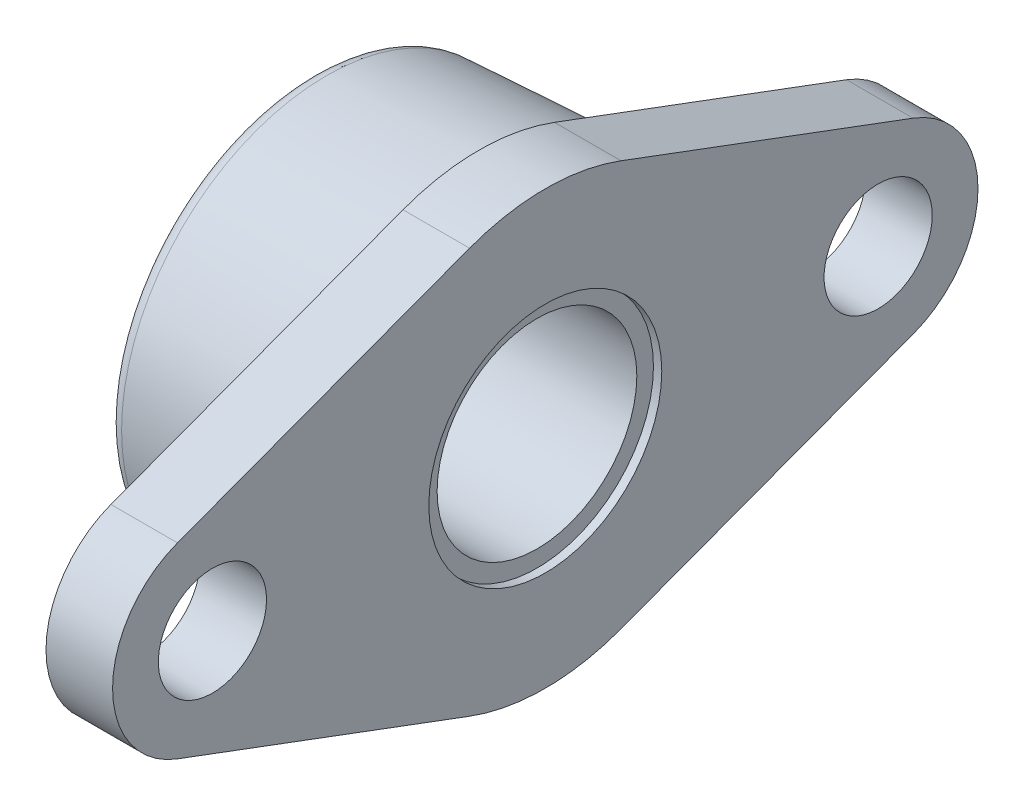
ISO-10303-21;
HEADER;
FILE_DESCRIPTION(('STEP AP214'),'2;1');
FILE_NAME('part.step','',(''),(''),'','','');
FILE_SCHEMA(('AUTOMOTIVE_DESIGN { 1 0 10303 214 1 1 1 1 }'));
ENDSEC;
DATA;
#1=APPLICATION_CONTEXT('core data for automotive mechanical design processes');
#2=APPLICATION_PROTOCOL_DEFINITION('international standard','automotive_design',2000,#1);
#3=PRODUCT_CONTEXT('',#1,'mechanical');
#4=PRODUCT('Part','Part','',(#3));
#5=PRODUCT_RELATED_PRODUCT_CATEGORY('part','',(#4));
#6=PRODUCT_DEFINITION_FORMATION('','',#4);
#7=PRODUCT_DEFINITION_CONTEXT('part definition',#1,'design');
#8=PRODUCT_DEFINITION('design','',#6,#7);
#9=PRODUCT_DEFINITION_SHAPE('','',#8);
#10=(LENGTH_UNIT() NAMED_UNIT(*) SI_UNIT(.MILLI.,.METRE.));
#11=(NAMED_UNIT(*) PLANE_ANGLE_UNIT() SI_UNIT($,.RADIAN.));
#12=(NAMED_UNIT(*) SI_UNIT($,.STERADIAN.) SOLID_ANGLE_UNIT());
#13=UNCERTAINTY_MEASURE_WITH_UNIT(LENGTH_MEASURE(1.E-05),#10,'distance_accuracy_value','');
#14=(GEOMETRIC_REPRESENTATION_CONTEXT(3) GLOBAL_UNCERTAINTY_ASSIGNED_CONTEXT((#13)) GLOBAL_UNIT_ASSIGNED_CONTEXT((#10,
#11,#12)) REPRESENTATION_CONTEXT('',''));
#15=CARTESIAN_POINT('',(0.,0.,0.));
#16=DIRECTION('',(0.,0.,1.));
#17=DIRECTION('',(1.,0.,0.));
#18=AXIS2_PLACEMENT_3D('',#15,#16,#17);
#19=CARTESIAN_POINT('',(0.,0.,0.));
#20=DIRECTION('',(-1.,0.,0.));
#21=DIRECTION('',(0.,0.,1.));
#22=AXIS2_PLACEMENT_3D('',#19,#20,#21);
#23=CYLINDRICAL_SURFACE('',#22,9.525);
#24=CARTESIAN_POINT('',(-22.2250000000001,0.,0.));
#25=DIRECTION('',(-1.,0.,0.));
#26=DIRECTION('',(0.,0.,1.));
#27=AXIS2_PLACEMENT_3D('',#24,#25,#26);
#28=CIRCLE('',#27,9.525);
#29=CARTESIAN_POINT('',(-22.2250000000001,0.,9.52499999999999));
#30=VERTEX_POINT('',#29);
#31=EDGE_CURVE('E170',#30,#30,#28,.T.);
#32=ORIENTED_EDGE('',*,*,#31,.T.);
#33=EDGE_LOOP('',(#32));
#34=FACE_BOUND('',#33,.T.);
#35=CARTESIAN_POINT('',(-0.793750000000037,0.,0.));
#36=DIRECTION('',(1.,0.,0.));
#37=DIRECTION('',(0.,0.,-1.));
#38=AXIS2_PLACEMENT_3D('',#35,#36,#37);
#39=CIRCLE('',#38,9.525);
#40=CARTESIAN_POINT('',(-0.793750000000037,0.,-9.525));
#41=VERTEX_POINT('',#40);
#42=EDGE_CURVE('E168',#41,#41,#39,.F.);
#43=ORIENTED_EDGE('',*,*,#42,.F.);
#44=EDGE_LOOP('',(#43));
#45=FACE_BOUND('',#44,.T.);
#46=ADVANCED_FACE('F34',(#34,#45),#23,.F.);
#47=CARTESIAN_POINT('',(-22.2250000000001,0.,0.));
#48=DIRECTION('',(-1.,0.,0.));
#49=DIRECTION('',(0.,0.,1.));
#50=AXIS2_PLACEMENT_3D('',#47,#48,#49);
#51=PLANE('',#50);
#52=CARTESIAN_POINT('',(-22.2250000000001,0.,0.));
#53=DIRECTION('',(-1.,0.,0.));
#54=DIRECTION('',(0.,0.,1.));
#55=AXIS2_PLACEMENT_3D('',#52,#53,#54);
#56=CIRCLE('',#55,18.1169039807405);
#57=CARTESIAN_POINT('',(-22.2250000000001,0.,18.1169039807405));
#58=VERTEX_POINT('',#57);
#59=EDGE_CURVE('E43',#58,#58,#56,.T.);
#60=ORIENTED_EDGE('',*,*,#59,.T.);
#61=EDGE_LOOP('',(#60));
#62=FACE_BOUND('',#61,.T.);
#63=CARTESIAN_POINT('',(-22.2250000000001,0.,0.));
#64=DIRECTION('',(-1.,0.,0.));
#65=DIRECTION('',(0.,0.,1.));
#66=AXIS2_PLACEMENT_3D('',#63,#64,#65);
#67=CIRCLE('',#66,11.1125);
#68=CARTESIAN_POINT('',(-22.2250000000001,0.,11.1125));
#69=VERTEX_POINT('',#68);
#70=EDGE_CURVE('E269',#69,#69,#67,.T.);
#71=ORIENTED_EDGE('',*,*,#70,.F.);
#72=EDGE_LOOP('',(#71));
#73=FACE_BOUND('',#72,.T.);
#74=ADVANCED_FACE('F223',(#62,#73),#51,.T.);
#75=CARTESIAN_POINT('',(-6.34999999999997,0.,0.));
#76=DIRECTION('',(1.,0.,0.));
#77=DIRECTION('',(0.,0.,-1.));
#78=AXIS2_PLACEMENT_3D('',#75,#76,#77);
#79=CYLINDRICAL_SURFACE('',#78,20.6375);
#80=CARTESIAN_POINT('',(0.,0.,0.));
#81=DIRECTION('',(1.,0.,0.));
#82=DIRECTION('',(0.,0.,-1.));
#83=AXIS2_PLACEMENT_3D('',#80,#81,#82);
#84=CIRCLE('',#83,20.6375);
#85=CARTESIAN_POINT('',(0.,-19.332171928792,7.223125));
#86=VERTEX_POINT('',#85);
#87=CARTESIAN_POINT('',(0.,-19.332171928792,-7.223125));
#88=VERTEX_POINT('',#87);
#89=EDGE_CURVE('E134',#86,#88,#84,.T.);
#90=ORIENTED_EDGE('',*,*,#89,.F.);
#91=DIRECTION('',(1.,0.,0.));
#92=VECTOR('',#91,1.);
#93=CARTESIAN_POINT('',(-6.34999999999997,-19.332171928792,7.223125));
#94=LINE('',#93,#92);
#95=CARTESIAN_POINT('',(-6.34999999999997,-19.332171928792,7.223125));
#96=VERTEX_POINT('',#95);
#97=EDGE_CURVE('E51',#96,#86,#94,.T.);
#98=ORIENTED_EDGE('',*,*,#97,.F.);
#99=CARTESIAN_POINT('',(-6.34999999999997,0.,0.));
#100=DIRECTION('',(1.,0.,0.));
#101=DIRECTION('',(0.,0.,-1.));
#102=AXIS2_PLACEMENT_3D('',#99,#100,#101);
#103=CIRCLE('',#102,20.6375);
#104=CARTESIAN_POINT('',(-6.34999999999997,-19.332171928792,-7.223125));
#105=VERTEX_POINT('',#104);
#106=EDGE_CURVE('E156',#96,#105,#103,.T.);
#107=ORIENTED_EDGE('',*,*,#106,.T.);
#108=DIRECTION('',(1.,0.,0.));
#109=VECTOR('',#108,1.);
#110=CARTESIAN_POINT('',(-6.34999999999997,-19.332171928792,-7.223125));
#111=LINE('',#110,#109);
#112=EDGE_CURVE('E92',#105,#88,#111,.T.);
#113=ORIENTED_EDGE('',*,*,#112,.T.);
#114=EDGE_LOOP('',(#90,#98,#107,#113));
#115=FACE_BOUND('',#114,.T.);
#116=ADVANCED_FACE('F211',(#115),#79,.T.);
#117=CARTESIAN_POINT('',(-6.34999999999997,-19.332171928792,7.223125));
#118=DIRECTION('',(0.,-0.93674969975976,0.35));
#119=DIRECTION('',(0.,-0.35,-0.93674969975976));
#120=AXIS2_PLACEMENT_3D('',#117,#118,#119);
#121=PLANE('',#120);
#122=DIRECTION('',(0.,-0.35,-0.93674969975976));
#123=VECTOR('',#122,1.);
#124=CARTESIAN_POINT('',(0.,-19.332171928792,7.223125));
#125=LINE('',#124,#123);
#126=CARTESIAN_POINT('',(0.,-8.92254089021174,35.08375));
#127=VERTEX_POINT('',#126);
#128=EDGE_CURVE('E153',#127,#86,#125,.T.);
#129=ORIENTED_EDGE('',*,*,#128,.F.);
#130=DIRECTION('',(1.,0.,0.));
#131=VECTOR('',#130,1.);
#132=CARTESIAN_POINT('',(-6.34999999999997,-8.92254089021174,35.08375));
#133=LINE('',#132,#131);
#134=CARTESIAN_POINT('',(-6.34999999999997,-8.92254089021174,35.08375));
#135=VERTEX_POINT('',#134);
#136=EDGE_CURVE('E80',#135,#127,#133,.T.);
#137=ORIENTED_EDGE('',*,*,#136,.F.);
#138=DIRECTION('',(0.,-0.35,-0.93674969975976));
#139=VECTOR('',#138,1.);
#140=CARTESIAN_POINT('',(-6.34999999999997,-19.332171928792,7.223125));
#141=LINE('',#140,#139);
#142=EDGE_CURVE('E124',#135,#96,#141,.T.);
#143=ORIENTED_EDGE('',*,*,#142,.T.);
#144=ORIENTED_EDGE('',*,*,#97,.T.);
#145=EDGE_LOOP('',(#129,#137,#143,#144));
#146=FACE_BOUND('',#145,.T.);
#147=ADVANCED_FACE('F215',(#146),#121,.T.);
#148=CARTESIAN_POINT('',(-6.34999999999997,0.,31.7500000000001));
#149=DIRECTION('',(1.,0.,0.));
#150=DIRECTION('',(0.,0.,-1.));
#151=AXIS2_PLACEMENT_3D('',#148,#149,#150);
#152=CYLINDRICAL_SURFACE('',#151,9.525);
#153=CARTESIAN_POINT('',(0.,0.,31.7500000000001));
#154=DIRECTION('',(1.,0.,0.));
#155=DIRECTION('',(0.,0.,-1.));
#156=AXIS2_PLACEMENT_3D('',#153,#154,#155);
#157=CIRCLE('',#156,9.525);
#158=CARTESIAN_POINT('',(0.,8.92254089021166,35.0837500000001));
#159=VERTEX_POINT('',#158);
#160=EDGE_CURVE('E111',#159,#127,#157,.T.);
#161=ORIENTED_EDGE('',*,*,#160,.F.);
#162=DIRECTION('',(1.,0.,0.));
#163=VECTOR('',#162,1.);
#164=CARTESIAN_POINT('',(-6.34999999999997,8.92254089021166,35.0837500000001));
#165=LINE('',#164,#163);
#166=CARTESIAN_POINT('',(-6.34999999999997,8.92254089021166,35.0837500000001));
#167=VERTEX_POINT('',#166);
#168=EDGE_CURVE('E106',#167,#159,#165,.T.);
#169=ORIENTED_EDGE('',*,*,#168,.F.);
#170=CARTESIAN_POINT('',(-6.34999999999997,0.,31.7500000000001));
#171=DIRECTION('',(1.,0.,0.));
#172=DIRECTION('',(0.,0.,-1.));
#173=AXIS2_PLACEMENT_3D('',#170,#171,#172);
#174=CIRCLE('',#173,9.525);
#175=EDGE_CURVE('E109',#167,#135,#174,.T.);
#176=ORIENTED_EDGE('',*,*,#175,.T.);
#177=ORIENTED_EDGE('',*,*,#136,.T.);
#178=EDGE_LOOP('',(#161,#169,#176,#177));
#179=FACE_BOUND('',#178,.T.);
#180=ADVANCED_FACE('F108',(#179),#152,.T.);
#181=CARTESIAN_POINT('',(-6.34999999999997,19.3321719287921,7.223125));
#182=DIRECTION('',(0.,0.93674969975976,0.35));
#183=DIRECTION('',(0.,-0.35,0.93674969975976));
#184=AXIS2_PLACEMENT_3D('',#181,#182,#183);
#185=PLANE('',#184);
#186=DIRECTION('',(0.,-0.35,0.93674969975976));
#187=VECTOR('',#186,1.);
#188=CARTESIAN_POINT('',(0.,19.3321719287921,7.223125));
#189=LINE('',#188,#187);
#190=CARTESIAN_POINT('',(0.,19.3321719287921,7.223125));
#191=VERTEX_POINT('',#190);
#192=EDGE_CURVE('E150',#191,#159,#189,.T.);
#193=ORIENTED_EDGE('',*,*,#192,.F.);
#194=DIRECTION('',(1.,0.,0.));
#195=VECTOR('',#194,1.);
#196=CARTESIAN_POINT('',(-6.34999999999997,19.3321719287921,7.223125));
#197=LINE('',#196,#195);
#198=CARTESIAN_POINT('',(-6.34999999999997,19.3321719287921,7.223125));
#199=VERTEX_POINT('',#198);
#200=EDGE_CURVE('E116',#199,#191,#197,.T.);
#201=ORIENTED_EDGE('',*,*,#200,.F.);
#202=DIRECTION('',(0.,-0.35,0.93674969975976));
#203=VECTOR('',#202,1.);
#204=CARTESIAN_POINT('',(-6.34999999999997,19.3321719287921,7.223125));
#205=LINE('',#204,#203);
#206=EDGE_CURVE('E122',#199,#167,#205,.T.);
#207=ORIENTED_EDGE('',*,*,#206,.T.);
#208=ORIENTED_EDGE('',*,*,#168,.T.);
#209=EDGE_LOOP('',(#193,#201,#207,#208));
#210=FACE_BOUND('',#209,.T.);
#211=ADVANCED_FACE('F126',(#210),#185,.T.);
#212=CARTESIAN_POINT('',(-6.34999999999997,0.,0.));
#213=DIRECTION('',(1.,0.,0.));
#214=DIRECTION('',(0.,0.,-1.));
#215=AXIS2_PLACEMENT_3D('',#212,#213,#214);
#216=CYLINDRICAL_SURFACE('',#215,20.6375);
#217=CARTESIAN_POINT('',(0.,0.,0.));
#218=DIRECTION('',(1.,0.,0.));
#219=DIRECTION('',(0.,0.,-1.));
#220=AXIS2_PLACEMENT_3D('',#217,#218,#219);
#221=CIRCLE('',#220,20.6375);
#222=CARTESIAN_POINT('',(0.,19.3321719287921,-7.22312500000011));
#223=VERTEX_POINT('',#222);
#224=EDGE_CURVE('E147',#223,#191,#221,.T.);
#225=ORIENTED_EDGE('',*,*,#224,.F.);
#226=DIRECTION('',(1.,0.,0.));
#227=VECTOR('',#226,1.);
#228=CARTESIAN_POINT('',(-6.34999999999997,19.3321719287921,-7.22312500000011));
#229=LINE('',#228,#227);
#230=CARTESIAN_POINT('',(-6.34999999999997,19.3321719287921,-7.22312500000011));
#231=VERTEX_POINT('',#230);
#232=EDGE_CURVE('E161',#231,#223,#229,.T.);
#233=ORIENTED_EDGE('',*,*,#232,.F.);
#234=CARTESIAN_POINT('',(-6.34999999999997,0.,0.));
#235=DIRECTION('',(1.,0.,0.));
#236=DIRECTION('',(0.,0.,-1.));
#237=AXIS2_PLACEMENT_3D('',#234,#235,#236);
#238=CIRCLE('',#237,20.6375);
#239=EDGE_CURVE('E127',#231,#199,#238,.T.);
#240=ORIENTED_EDGE('',*,*,#239,.T.);
#241=ORIENTED_EDGE('',*,*,#200,.T.);
#242=EDGE_LOOP('',(#225,#233,#240,#241));
#243=FACE_BOUND('',#242,.T.);
#244=ADVANCED_FACE('F370',(#243),#216,.T.);
#245=CARTESIAN_POINT('',(-6.34999999999997,8.92254089021167,-35.0837500000002));
#246=DIRECTION('',(0.,0.93674969975976,-0.35));
#247=DIRECTION('',(0.,0.35,0.93674969975976));
#248=AXIS2_PLACEMENT_3D('',#245,#246,#247);
#249=PLANE('',#248);
#250=DIRECTION('',(0.,0.35,0.93674969975976));
#251=VECTOR('',#250,1.);
#252=CARTESIAN_POINT('',(0.,8.92254089021167,-35.0837500000002));
#253=LINE('',#252,#251);
#254=CARTESIAN_POINT('',(0.,8.92254089021167,-35.0837500000002));
#255=VERTEX_POINT('',#254);
#256=EDGE_CURVE('E144',#255,#223,#253,.T.);
#257=ORIENTED_EDGE('',*,*,#256,.F.);
#258=DIRECTION('',(1.,0.,0.));
#259=VECTOR('',#258,1.);
#260=CARTESIAN_POINT('',(-6.34999999999997,8.92254089021167,-35.0837500000002));
#261=LINE('',#260,#259);
#262=CARTESIAN_POINT('',(-6.34999999999997,8.92254089021167,-35.0837500000002));
#263=VERTEX_POINT('',#262);
#264=EDGE_CURVE('E163',#263,#255,#261,.T.);
#265=ORIENTED_EDGE('',*,*,#264,.F.);
#266=DIRECTION('',(0.,0.35,0.93674969975976));
#267=VECTOR('',#266,1.);
#268=CARTESIAN_POINT('',(-6.34999999999997,8.92254089021167,-35.0837500000002));
#269=LINE('',#268,#267);
#270=EDGE_CURVE('E129',#263,#231,#269,.T.);
#271=ORIENTED_EDGE('',*,*,#270,.T.);
#272=ORIENTED_EDGE('',*,*,#232,.T.);
#273=EDGE_LOOP('',(#257,#265,#271,#272));
#274=FACE_BOUND('',#273,.T.);
#275=ADVANCED_FACE('F204',(#274),#249,.T.);
#276=CARTESIAN_POINT('',(-6.34999999999997,0.,-31.7500000000001));
#277=DIRECTION('',(1.,0.,0.));
#278=DIRECTION('',(0.,0.,-1.));
#279=AXIS2_PLACEMENT_3D('',#276,#277,#278);
#280=CYLINDRICAL_SURFACE('',#279,9.525);
#281=CARTESIAN_POINT('',(0.,0.,-31.7500000000001));
#282=DIRECTION('',(1.,0.,0.));
#283=DIRECTION('',(0.,0.,-1.));
#284=AXIS2_PLACEMENT_3D('',#281,#282,#283);
#285=CIRCLE('',#284,9.525);
#286=CARTESIAN_POINT('',(0.,-8.92254089021175,-35.0837499999997));
#287=VERTEX_POINT('',#286);
#288=EDGE_CURVE('E141',#287,#255,#285,.T.);
#289=ORIENTED_EDGE('',*,*,#288,.F.);
#290=DIRECTION('',(1.,0.,0.));
#291=VECTOR('',#290,1.);
#292=CARTESIAN_POINT('',(-6.34999999999997,-8.92254089021175,-35.0837499999997));
#293=LINE('',#292,#291);
#294=CARTESIAN_POINT('',(-6.34999999999997,-8.92254089021175,-35.0837499999997));
#295=VERTEX_POINT('',#294);
#296=EDGE_CURVE('E165',#295,#287,#293,.T.);
#297=ORIENTED_EDGE('',*,*,#296,.F.);
#298=CARTESIAN_POINT('',(-6.34999999999997,0.,-31.7500000000001));
#299=DIRECTION('',(1.,0.,0.));
#300=DIRECTION('',(0.,0.,-1.));
#301=AXIS2_PLACEMENT_3D('',#298,#299,#300);
#302=CIRCLE('',#301,9.525);
#303=EDGE_CURVE('E198',#295,#263,#302,.T.);
#304=ORIENTED_EDGE('',*,*,#303,.T.);
#305=ORIENTED_EDGE('',*,*,#264,.T.);
#306=EDGE_LOOP('',(#289,#297,#304,#305));
#307=FACE_BOUND('',#306,.T.);
#308=ADVANCED_FACE('F209',(#307),#280,.T.);
#309=CARTESIAN_POINT('',(-6.34999999999997,-19.332171928792,-7.223125));
#310=DIRECTION('',(0.,-0.93674969975976,-0.35));
#311=DIRECTION('',(0.,0.35,-0.93674969975976));
#312=AXIS2_PLACEMENT_3D('',#309,#310,#311);
#313=PLANE('',#312);
#314=DIRECTION('',(0.,0.35,-0.93674969975976));
#315=VECTOR('',#314,1.);
#316=CARTESIAN_POINT('',(0.,-19.332171928792,-7.223125));
#317=LINE('',#316,#315);
#318=EDGE_CURVE('E137',#88,#287,#317,.T.);
#319=ORIENTED_EDGE('',*,*,#318,.F.);
#320=ORIENTED_EDGE('',*,*,#112,.F.);
#321=DIRECTION('',(0.,0.35,-0.93674969975976));
#322=VECTOR('',#321,1.);
#323=CARTESIAN_POINT('',(-6.34999999999997,-19.332171928792,-7.223125));
#324=LINE('',#323,#322);
#325=EDGE_CURVE('E196',#105,#295,#324,.T.);
#326=ORIENTED_EDGE('',*,*,#325,.T.);
#327=ORIENTED_EDGE('',*,*,#296,.T.);
#328=EDGE_LOOP('',(#319,#320,#326,#327));
#329=FACE_BOUND('',#328,.T.);
#330=ADVANCED_FACE('F210',(#329),#313,.T.);
#331=CARTESIAN_POINT('',(-6.34999999999997,0.,0.));
#332=DIRECTION('',(1.,0.,0.));
#333=DIRECTION('',(0.,0.,-1.));
#334=AXIS2_PLACEMENT_3D('',#331,#332,#333);
#335=PLANE('',#334);
#336=CARTESIAN_POINT('',(-6.34999999999997,0.,0.));
#337=DIRECTION('',(1.,0.,0.));
#338=DIRECTION('',(0.,0.,-1.));
#339=AXIS2_PLACEMENT_3D('',#336,#337,#338);
#340=CIRCLE('',#339,20.3047106015527);
#341=CARTESIAN_POINT('',(-6.34999999999997,0.,-20.3047106015527));
#342=VERTEX_POINT('',#341);
#343=EDGE_CURVE('E158',#342,#342,#340,.F.);
#344=ORIENTED_EDGE('',*,*,#343,.F.);
#345=EDGE_LOOP('',(#344));
#346=FACE_BOUND('',#345,.T.);
#347=CARTESIAN_POINT('',(-6.34999999999997,0.,-31.7500000000001));
#348=DIRECTION('',(1.,0.,0.));
#349=DIRECTION('',(0.,0.,-1.));
#350=AXIS2_PLACEMENT_3D('',#347,#348,#349);
#351=CIRCLE('',#350,5.159375);
#352=CARTESIAN_POINT('',(-6.34999999999997,0.,-36.9093750000001));
#353=VERTEX_POINT('',#352);
#354=EDGE_CURVE('E183',#353,#353,#351,.T.);
#355=ORIENTED_EDGE('',*,*,#354,.T.);
#356=EDGE_LOOP('',(#355));
#357=FACE_BOUND('',#356,.T.);
#358=CARTESIAN_POINT('',(-6.34999999999997,0.,31.7500000000001));
#359=DIRECTION('',(1.,0.,0.));
#360=DIRECTION('',(0.,0.,-1.));
#361=AXIS2_PLACEMENT_3D('',#358,#359,#360);
#362=CIRCLE('',#361,5.159375);
#363=CARTESIAN_POINT('',(-6.34999999999997,0.,26.5906250000001));
#364=VERTEX_POINT('',#363);
#365=EDGE_CURVE('E138',#364,#364,#362,.T.);
#366=ORIENTED_EDGE('',*,*,#365,.T.);
#367=EDGE_LOOP('',(#366));
#368=FACE_BOUND('',#367,.T.);
#369=ORIENTED_EDGE('',*,*,#106,.F.);
#370=ORIENTED_EDGE('',*,*,#142,.F.);
#371=ORIENTED_EDGE('',*,*,#175,.F.);
#372=ORIENTED_EDGE('',*,*,#206,.F.);
#373=ORIENTED_EDGE('',*,*,#239,.F.);
#374=ORIENTED_EDGE('',*,*,#270,.F.);
#375=ORIENTED_EDGE('',*,*,#303,.F.);
#376=ORIENTED_EDGE('',*,*,#325,.F.);
#377=EDGE_LOOP('',(#369,#370,#371,#372,#373,#374,#375,#376));
#378=FACE_BOUND('',#377,.T.);
#379=ADVANCED_FACE('F120',(#346,#357,#368,#378),#335,.F.);
#380=CARTESIAN_POINT('',(0.,0.,0.));
#381=DIRECTION('',(1.,0.,0.));
#382=DIRECTION('',(0.,0.,-1.));
#383=AXIS2_PLACEMENT_3D('',#380,#381,#382);
#384=PLANE('',#383);
#385=CARTESIAN_POINT('',(0.,0.,0.));
#386=DIRECTION('',(1.,0.,0.));
#387=DIRECTION('',(0.,0.,-1.));
#388=AXIS2_PLACEMENT_3D('',#385,#386,#387);
#389=CIRCLE('',#388,11.1125);
#390=CARTESIAN_POINT('',(0.,0.,-11.1125));
#391=VERTEX_POINT('',#390);
#392=EDGE_CURVE('E260',#391,#391,#389,.T.);
#393=ORIENTED_EDGE('',*,*,#392,.F.);
#394=EDGE_LOOP('',(#393));
#395=FACE_BOUND('',#394,.T.);
#396=CARTESIAN_POINT('',(0.,0.,-31.7500000000001));
#397=DIRECTION('',(1.,0.,0.));
#398=DIRECTION('',(0.,0.,-1.));
#399=AXIS2_PLACEMENT_3D('',#396,#397,#398);
#400=CIRCLE('',#399,5.159375);
#401=CARTESIAN_POINT('',(0.,0.,-36.9093750000001));
#402=VERTEX_POINT('',#401);
#403=EDGE_CURVE('E187',#402,#402,#400,.T.);
#404=ORIENTED_EDGE('',*,*,#403,.F.);
#405=EDGE_LOOP('',(#404));
#406=FACE_BOUND('',#405,.T.);
#407=ORIENTED_EDGE('',*,*,#256,.T.);
#408=ORIENTED_EDGE('',*,*,#224,.T.);
#409=ORIENTED_EDGE('',*,*,#192,.T.);
#410=ORIENTED_EDGE('',*,*,#160,.T.);
#411=ORIENTED_EDGE('',*,*,#128,.T.);
#412=ORIENTED_EDGE('',*,*,#89,.T.);
#413=ORIENTED_EDGE('',*,*,#318,.T.);
#414=ORIENTED_EDGE('',*,*,#288,.T.);
#415=EDGE_LOOP('',(#407,#408,#409,#410,#411,#412,#413,#414));
#416=FACE_BOUND('',#415,.T.);
#417=CARTESIAN_POINT('',(0.,0.,31.7500000000001));
#418=DIRECTION('',(1.,0.,0.));
#419=DIRECTION('',(0.,0.,-1.));
#420=AXIS2_PLACEMENT_3D('',#417,#418,#419);
#421=CIRCLE('',#420,5.159375);
#422=CARTESIAN_POINT('',(0.,0.,26.5906250000001));
#423=VERTEX_POINT('',#422);
#424=EDGE_CURVE('E186',#423,#423,#421,.T.);
#425=ORIENTED_EDGE('',*,*,#424,.F.);
#426=EDGE_LOOP('',(#425));
#427=FACE_BOUND('',#426,.T.);
#428=ADVANCED_FACE('F213',(#395,#406,#416,#427),#384,.T.);
#429=CARTESIAN_POINT('',(-6.34999999999997,0.,31.7500000000001));
#430=DIRECTION('',(1.,0.,0.));
#431=DIRECTION('',(0.,0.,-1.));
#432=AXIS2_PLACEMENT_3D('',#429,#430,#431);
#433=CYLINDRICAL_SURFACE('',#432,5.159375);
#434=ORIENTED_EDGE('',*,*,#365,.F.);
#435=EDGE_LOOP('',(#434));
#436=FACE_BOUND('',#435,.T.);
#437=ORIENTED_EDGE('',*,*,#424,.T.);
#438=EDGE_LOOP('',(#437));
#439=FACE_BOUND('',#438,.T.);
#440=ADVANCED_FACE('F246',(#436,#439),#433,.F.);
#441=CARTESIAN_POINT('',(-6.34999999999997,0.,-31.7500000000001));
#442=DIRECTION('',(1.,0.,0.));
#443=DIRECTION('',(0.,0.,-1.));
#444=AXIS2_PLACEMENT_3D('',#441,#442,#443);
#445=CYLINDRICAL_SURFACE('',#444,5.159375);
#446=ORIENTED_EDGE('',*,*,#354,.F.);
#447=EDGE_LOOP('',(#446));
#448=FACE_BOUND('',#447,.T.);
#449=ORIENTED_EDGE('',*,*,#403,.T.);
#450=EDGE_LOOP('',(#449));
#451=FACE_BOUND('',#450,.T.);
#452=ADVANCED_FACE('F242',(#448,#451),#445,.F.);
#453=CARTESIAN_POINT('',(0.,0.,0.));
#454=DIRECTION('',(1.,0.,0.));
#455=DIRECTION('',(0.,0.,1.));
#456=AXIS2_PLACEMENT_3D('',#453,#454,#455);
#457=CONICAL_SURFACE('',#456,20.6375,0.05235987755983);
#458=CARTESIAN_POINT('',(-20.8710249974821,0.,0.));
#459=DIRECTION('',(1.,0.,0.));
#460=DIRECTION('',(0.,0.,-1.));
#461=AXIS2_PLACEMENT_3D('',#458,#459,#460);
#462=CIRCLE('',#461,19.5436959285211);
#463=CARTESIAN_POINT('',(-20.8710249974821,0.,-19.5436959285211));
#464=VERTEX_POINT('',#463);
#465=EDGE_CURVE('E11',#464,#464,#462,.T.);
#466=ORIENTED_EDGE('',*,*,#465,.T.);
#467=EDGE_LOOP('',(#466));
#468=FACE_BOUND('',#467,.T.);
#469=ORIENTED_EDGE('',*,*,#343,.T.);
#470=EDGE_LOOP('',(#469));
#471=FACE_BOUND('',#470,.T.);
#472=ADVANCED_FACE('F238',(#468,#471),#457,.T.);
#473=CARTESIAN_POINT('',(-22.2504,0.,0.));
#474=DIRECTION('',(-1.,0.,0.));
#475=DIRECTION('',(0.,0.,1.));
#476=AXIS2_PLACEMENT_3D('',#473,#474,#475);
#477=PLANE('',#476);
#478=CARTESIAN_POINT('',(-22.2504,0.,0.));
#479=DIRECTION('',(-1.,0.,0.));
#480=DIRECTION('',(0.,0.,1.));
#481=AXIS2_PLACEMENT_3D('',#478,#479,#480);
#482=CIRCLE('',#481,11.1056940905122);
#483=CARTESIAN_POINT('',(-22.2504,0.,11.1056940905122));
#484=VERTEX_POINT('',#483);
#485=EDGE_CURVE('E190',#484,#484,#482,.T.);
#486=ORIENTED_EDGE('',*,*,#485,.T.);
#487=EDGE_LOOP('',(#486));
#488=FACE_BOUND('',#487,.T.);
#489=CARTESIAN_POINT('',(-22.2504,0.,0.));
#490=DIRECTION('',(-1.,0.,0.));
#491=DIRECTION('',(0.,0.,1.));
#492=AXIS2_PLACEMENT_3D('',#489,#490,#491);
#493=CIRCLE('',#492,9.53180590948775);
#494=CARTESIAN_POINT('',(-22.2504,0.,9.53180590948773));
#495=VERTEX_POINT('',#494);
#496=EDGE_CURVE('E181',#495,#495,#493,.T.);
#497=ORIENTED_EDGE('',*,*,#496,.F.);
#498=EDGE_LOOP('',(#497));
#499=FACE_BOUND('',#498,.T.);
#500=ADVANCED_FACE('F241',(#488,#499),#477,.T.);
#501=CARTESIAN_POINT('',(-22.2250000000001,0.,0.));
#502=DIRECTION('',(1.,0.,0.));
#503=DIRECTION('',(0.,0.,1.));
#504=AXIS2_PLACEMENT_3D('',#501,#502,#503);
#505=CONICAL_SURFACE('',#504,11.1125,0.26179938779915);
#506=ORIENTED_EDGE('',*,*,#485,.F.);
#507=EDGE_LOOP('',(#506));
#508=FACE_BOUND('',#507,.T.);
#509=ORIENTED_EDGE('',*,*,#70,.T.);
#510=EDGE_LOOP('',(#509));
#511=FACE_BOUND('',#510,.T.);
#512=ADVANCED_FACE('F276',(#508,#511),#505,.T.);
#513=CARTESIAN_POINT('',(-22.2250000000001,0.,0.));
#514=DIRECTION('',(-1.,0.,0.));
#515=DIRECTION('',(0.,0.,1.));
#516=AXIS2_PLACEMENT_3D('',#513,#514,#515);
#517=CONICAL_SURFACE('',#516,9.525,0.26179938779915);
#518=ORIENTED_EDGE('',*,*,#496,.T.);
#519=EDGE_LOOP('',(#518));
#520=FACE_BOUND('',#519,.T.);
#521=ORIENTED_EDGE('',*,*,#31,.F.);
#522=EDGE_LOOP('',(#521));
#523=FACE_BOUND('',#522,.T.);
#524=ADVANCED_FACE('F235',(#520,#523),#517,.F.);
#525=CARTESIAN_POINT('',(-0.793750000000037,0.,0.));
#526=DIRECTION('',(1.,0.,0.));
#527=DIRECTION('',(0.,0.,-1.));
#528=AXIS2_PLACEMENT_3D('',#525,#526,#527);
#529=PLANE('',#528);
#530=CARTESIAN_POINT('',(-0.793750000000037,0.,0.));
#531=DIRECTION('',(1.,0.,0.));
#532=DIRECTION('',(0.,0.,-1.));
#533=AXIS2_PLACEMENT_3D('',#530,#531,#532);
#534=CIRCLE('',#533,11.1125);
#535=CARTESIAN_POINT('',(-0.793750000000037,0.,-11.1125));
#536=VERTEX_POINT('',#535);
#537=EDGE_CURVE('E171',#536,#536,#534,.T.);
#538=ORIENTED_EDGE('',*,*,#537,.T.);
#539=EDGE_LOOP('',(#538));
#540=FACE_BOUND('',#539,.T.);
#541=ORIENTED_EDGE('',*,*,#42,.T.);
#542=EDGE_LOOP('',(#541));
#543=FACE_BOUND('',#542,.T.);
#544=ADVANCED_FACE('F285',(#540,#543),#529,.T.);
#545=CARTESIAN_POINT('',(-0.793750000000037,0.,0.));
#546=DIRECTION('',(1.,0.,0.));
#547=DIRECTION('',(0.,0.,-1.));
#548=AXIS2_PLACEMENT_3D('',#545,#546,#547);
#549=CYLINDRICAL_SURFACE('',#548,11.1125);
#550=ORIENTED_EDGE('',*,*,#537,.F.);
#551=EDGE_LOOP('',(#550));
#552=FACE_BOUND('',#551,.T.);
#553=ORIENTED_EDGE('',*,*,#392,.T.);
#554=EDGE_LOOP('',(#553));
#555=FACE_BOUND('',#554,.T.);
#556=ADVANCED_FACE('F289',(#552,#555),#549,.F.);
#557=CARTESIAN_POINT('',(-20.79625,0.,0.));
#558=DIRECTION('',(-1.,0.,0.));
#559=DIRECTION('',(0.,0.,1.));
#560=AXIS2_PLACEMENT_3D('',#557,#558,#559);
#561=TOROIDAL_SURFACE('',#560,18.1169039807405,1.42875);
#562=ORIENTED_EDGE('',*,*,#465,.F.);
#563=EDGE_LOOP('',(#562));
#564=FACE_BOUND('',#563,.T.);
#565=ORIENTED_EDGE('',*,*,#59,.F.);
#566=EDGE_LOOP('',(#565));
#567=FACE_BOUND('',#566,.T.);
#568=ADVANCED_FACE('F36',(#564,#567),#561,.T.);
#569=CLOSED_SHELL('',(#46,#74,#116,#147,#180,#211,#244,#275,#308,#330,#379,#428,#440,#452,#472,
#500,#512,#524,#544,#556,#568));
#570=MANIFOLD_SOLID_BREP('B2',#569);
#571=ADVANCED_BREP_SHAPE_REPRESENTATION('',(#18,#570),#14);
#572=SHAPE_DEFINITION_REPRESENTATION(#9,#571);
ENDSEC;
END-ISO-10303-21;
